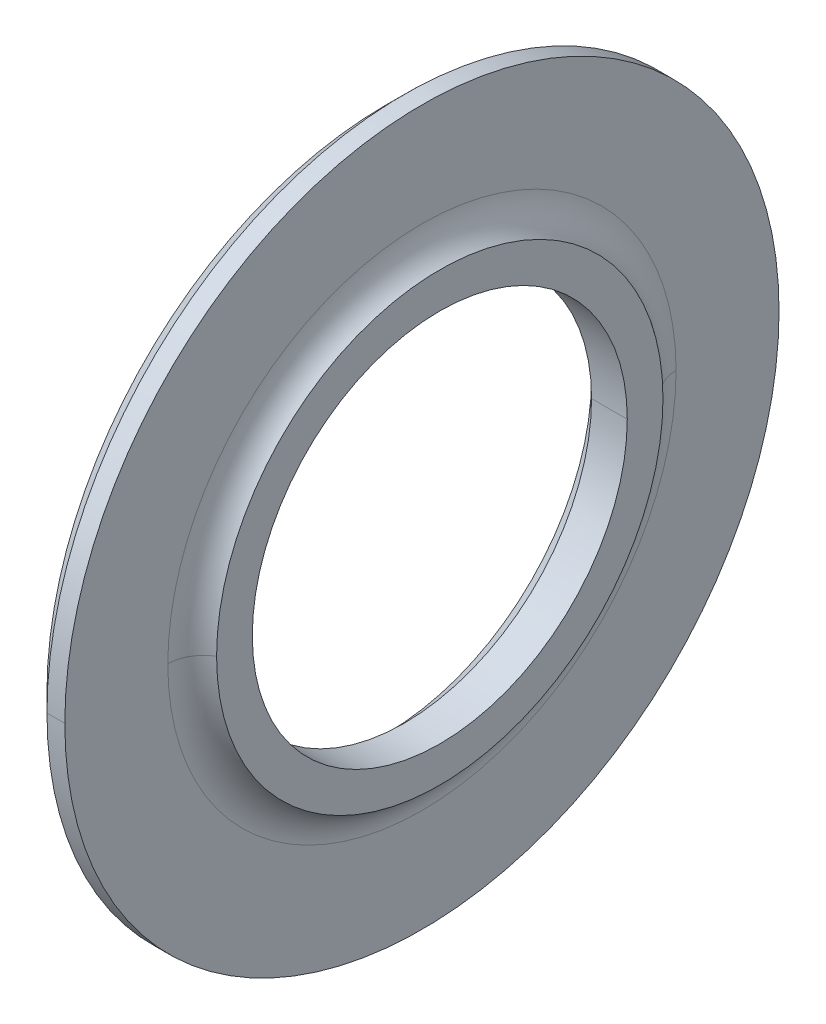
ISO-10303-21;
HEADER;
FILE_DESCRIPTION(('STEP AP214'),'2;1');
FILE_NAME('part.step','',(''),(''),'','','');
FILE_SCHEMA(('AUTOMOTIVE_DESIGN { 1 0 10303 214 1 1 1 1 }'));
ENDSEC;
DATA;
#1=APPLICATION_CONTEXT('core data for automotive mechanical design processes');
#2=APPLICATION_PROTOCOL_DEFINITION('international standard','automotive_design',2000,#1);
#3=PRODUCT_CONTEXT('',#1,'mechanical');
#4=PRODUCT('Part','Part','',(#3));
#5=PRODUCT_RELATED_PRODUCT_CATEGORY('part','',(#4));
#6=PRODUCT_DEFINITION_FORMATION('','',#4);
#7=PRODUCT_DEFINITION_CONTEXT('part definition',#1,'design');
#8=PRODUCT_DEFINITION('design','',#6,#7);
#9=PRODUCT_DEFINITION_SHAPE('','',#8);
#10=(LENGTH_UNIT() NAMED_UNIT(*) SI_UNIT(.MILLI.,.METRE.));
#11=(NAMED_UNIT(*) PLANE_ANGLE_UNIT() SI_UNIT($,.RADIAN.));
#12=(NAMED_UNIT(*) SI_UNIT($,.STERADIAN.) SOLID_ANGLE_UNIT());
#13=UNCERTAINTY_MEASURE_WITH_UNIT(LENGTH_MEASURE(1.E-05),#10,'distance_accuracy_value','');
#14=(GEOMETRIC_REPRESENTATION_CONTEXT(3) GLOBAL_UNCERTAINTY_ASSIGNED_CONTEXT((#13)) GLOBAL_UNIT_ASSIGNED_CONTEXT((#10,
#11,#12)) REPRESENTATION_CONTEXT('',''));
#15=CARTESIAN_POINT('',(0.,0.,0.));
#16=DIRECTION('',(0.,0.,1.));
#17=DIRECTION('',(1.,0.,0.));
#18=AXIS2_PLACEMENT_3D('',#15,#16,#17);
#19=CARTESIAN_POINT('',(2.,0.,0.));
#20=DIRECTION('',(-1.,0.,0.));
#21=DIRECTION('',(0.,0.,1.));
#22=AXIS2_PLACEMENT_3D('',#19,#20,#21);
#23=TOROIDAL_SURFACE('',#22,7.11602540378444,1.);
#24=CARTESIAN_POINT('',(1.,0.,0.));
#25=DIRECTION('',(-1.,0.,0.));
#26=DIRECTION('',(0.,0.,1.));
#27=AXIS2_PLACEMENT_3D('',#24,#25,#26);
#28=CIRCLE('',#27,7.11602540378444);
#29=CARTESIAN_POINT('',(1.,0.,-7.11602540378444));
#30=VERTEX_POINT('',#29);
#31=CARTESIAN_POINT('',(1.,0.,7.11602540378444));
#32=VERTEX_POINT('',#31);
#33=EDGE_CURVE('E39',#30,#32,#28,.T.);
#34=ORIENTED_EDGE('',*,*,#33,.F.);
#35=CARTESIAN_POINT('',(2.,0.,-7.11602540378444));
#36=DIRECTION('',(0.,1.,0.));
#37=DIRECTION('',(0.,0.,1.));
#38=AXIS2_PLACEMENT_3D('',#35,#36,#37);
#39=CIRCLE('',#38,1.);
#40=CARTESIAN_POINT('',(1.5,0.,-6.25));
#41=VERTEX_POINT('',#40);
#42=EDGE_CURVE('E11',#30,#41,#39,.T.);
#43=ORIENTED_EDGE('',*,*,#42,.T.);
#44=CARTESIAN_POINT('',(1.5,0.,0.));
#45=DIRECTION('',(-1.,0.,0.));
#46=DIRECTION('',(0.,0.,1.));
#47=AXIS2_PLACEMENT_3D('',#44,#45,#46);
#48=CIRCLE('',#47,6.25);
#49=CARTESIAN_POINT('',(1.5,0.,6.25));
#50=VERTEX_POINT('',#49);
#51=EDGE_CURVE('E26',#41,#50,#48,.T.);
#52=ORIENTED_EDGE('',*,*,#51,.T.);
#53=CARTESIAN_POINT('',(2.,0.,7.11602540378444));
#54=DIRECTION('',(0.,-1.,0.));
#55=DIRECTION('',(0.,0.,-1.));
#56=AXIS2_PLACEMENT_3D('',#53,#54,#55);
#57=CIRCLE('',#56,1.);
#58=EDGE_CURVE('E159',#32,#50,#57,.T.);
#59=ORIENTED_EDGE('',*,*,#58,.F.);
#60=EDGE_LOOP('',(#34,#43,#52,#59));
#61=FACE_BOUND('',#60,.T.);
#62=ADVANCED_FACE('F16',(#61),#23,.F.);
#63=CARTESIAN_POINT('',(0.,0.,0.));
#64=DIRECTION('',(1.,0.,0.));
#65=DIRECTION('',(0.,0.,-1.));
#66=AXIS2_PLACEMENT_3D('',#63,#64,#65);
#67=CONICAL_SURFACE('',#66,9.5,0.785398163397448);
#68=CARTESIAN_POINT('',(0.,0.,0.));
#69=DIRECTION('',(-1.,0.,0.));
#70=DIRECTION('',(0.,0.,-1.));
#71=AXIS2_PLACEMENT_3D('',#68,#69,#70);
#72=CIRCLE('',#71,9.5);
#73=CARTESIAN_POINT('',(0.,0.,9.5));
#74=VERTEX_POINT('',#73);
#75=CARTESIAN_POINT('',(0.,0.,-9.5));
#76=VERTEX_POINT('',#75);
#77=EDGE_CURVE('E142',#74,#76,#72,.T.);
#78=ORIENTED_EDGE('',*,*,#77,.F.);
#79=DIRECTION('',(0.707106781186548,0.,0.707106781186548));
#80=VECTOR('',#79,1.);
#81=CARTESIAN_POINT('',(0.,0.,9.5));
#82=LINE('',#81,#80);
#83=CARTESIAN_POINT('',(0.500000000000006,0.,10.));
#84=VERTEX_POINT('',#83);
#85=EDGE_CURVE('E184',#74,#84,#82,.T.);
#86=ORIENTED_EDGE('',*,*,#85,.T.);
#87=CARTESIAN_POINT('',(0.500000000000006,0.,0.));
#88=DIRECTION('',(1.,0.,0.));
#89=DIRECTION('',(0.,0.,-1.));
#90=AXIS2_PLACEMENT_3D('',#87,#88,#89);
#91=CIRCLE('',#90,10.);
#92=CARTESIAN_POINT('',(0.500000000000006,0.,-10.));
#93=VERTEX_POINT('',#92);
#94=EDGE_CURVE('E177',#93,#84,#91,.T.);
#95=ORIENTED_EDGE('',*,*,#94,.F.);
#96=DIRECTION('',(0.707106781186548,0.,-0.707106781186548));
#97=VECTOR('',#96,1.);
#98=CARTESIAN_POINT('',(0.,0.,-9.5));
#99=LINE('',#98,#97);
#100=EDGE_CURVE('E137',#76,#93,#99,.T.);
#101=ORIENTED_EDGE('',*,*,#100,.F.);
#102=EDGE_LOOP('',(#78,#86,#95,#101));
#103=FACE_BOUND('',#102,.T.);
#104=ADVANCED_FACE('F309',(#103),#67,.T.);
#105=CARTESIAN_POINT('',(0.499999999999993,0.,0.));
#106=DIRECTION('',(-1.,0.,0.));
#107=DIRECTION('',(0.,0.,1.));
#108=AXIS2_PLACEMENT_3D('',#105,#106,#107);
#109=CONICAL_SURFACE('',#108,5.25,0.78539816339745);
#110=CARTESIAN_POINT('',(0.499999999999993,0.,0.));
#111=DIRECTION('',(-1.,0.,0.));
#112=DIRECTION('',(0.,0.,-1.));
#113=AXIS2_PLACEMENT_3D('',#110,#111,#112);
#114=CIRCLE('',#113,5.25);
#115=CARTESIAN_POINT('',(0.499999999999993,0.,-5.25));
#116=VERTEX_POINT('',#115);
#117=CARTESIAN_POINT('',(0.499999999999993,0.,5.25));
#118=VERTEX_POINT('',#117);
#119=EDGE_CURVE('E167',#116,#118,#114,.T.);
#120=ORIENTED_EDGE('',*,*,#119,.F.);
#121=DIRECTION('',(-0.707106781186546,0.,-0.707106781186549));
#122=VECTOR('',#121,1.);
#123=CARTESIAN_POINT('',(0.499999999999993,0.,-5.25));
#124=LINE('',#123,#122);
#125=CARTESIAN_POINT('',(0.,0.,-5.75));
#126=VERTEX_POINT('',#125);
#127=EDGE_CURVE('E140',#116,#126,#124,.T.);
#128=ORIENTED_EDGE('',*,*,#127,.T.);
#129=CARTESIAN_POINT('',(0.,0.,0.));
#130=DIRECTION('',(1.,0.,0.));
#131=DIRECTION('',(0.,0.,-1.));
#132=AXIS2_PLACEMENT_3D('',#129,#130,#131);
#133=CIRCLE('',#132,5.75);
#134=CARTESIAN_POINT('',(0.,0.,5.75));
#135=VERTEX_POINT('',#134);
#136=EDGE_CURVE('E121',#135,#126,#133,.T.);
#137=ORIENTED_EDGE('',*,*,#136,.F.);
#138=DIRECTION('',(-0.707106781186546,0.,0.707106781186549));
#139=VECTOR('',#138,1.);
#140=CARTESIAN_POINT('',(0.499999999999993,0.,5.25));
#141=LINE('',#140,#139);
#142=EDGE_CURVE('E129',#118,#135,#141,.T.);
#143=ORIENTED_EDGE('',*,*,#142,.F.);
#144=EDGE_LOOP('',(#120,#128,#137,#143));
#145=FACE_BOUND('',#144,.T.);
#146=ADVANCED_FACE('F139',(#145),#109,.F.);
#147=CARTESIAN_POINT('',(0.,0.,0.));
#148=DIRECTION('',(-1.,0.,0.));
#149=DIRECTION('',(0.,0.,1.));
#150=AXIS2_PLACEMENT_3D('',#147,#148,#149);
#151=CYLINDRICAL_SURFACE('',#150,10.);
#152=CARTESIAN_POINT('',(1.,0.,0.));
#153=DIRECTION('',(-1.,0.,0.));
#154=DIRECTION('',(0.,0.,1.));
#155=AXIS2_PLACEMENT_3D('',#152,#153,#154);
#156=CIRCLE('',#155,10.);
#157=CARTESIAN_POINT('',(1.,0.,10.));
#158=VERTEX_POINT('',#157);
#159=CARTESIAN_POINT('',(1.,0.,-10.));
#160=VERTEX_POINT('',#159);
#161=EDGE_CURVE('E176',#158,#160,#156,.T.);
#162=ORIENTED_EDGE('',*,*,#161,.T.);
#163=DIRECTION('',(-1.,0.,0.));
#164=VECTOR('',#163,1.);
#165=CARTESIAN_POINT('',(0.,0.,-10.));
#166=LINE('',#165,#164);
#167=EDGE_CURVE('E99',#160,#93,#166,.T.);
#168=ORIENTED_EDGE('',*,*,#167,.T.);
#169=ORIENTED_EDGE('',*,*,#94,.T.);
#170=DIRECTION('',(-1.,0.,0.));
#171=VECTOR('',#170,1.);
#172=CARTESIAN_POINT('',(0.,0.,10.));
#173=LINE('',#172,#171);
#174=EDGE_CURVE('E110',#158,#84,#173,.T.);
#175=ORIENTED_EDGE('',*,*,#174,.F.);
#176=EDGE_LOOP('',(#162,#168,#169,#175));
#177=FACE_BOUND('',#176,.T.);
#178=ADVANCED_FACE('F308',(#177),#151,.T.);
#179=CARTESIAN_POINT('',(0.,0.,0.));
#180=DIRECTION('',(-1.,0.,0.));
#181=DIRECTION('',(0.,0.,1.));
#182=AXIS2_PLACEMENT_3D('',#179,#180,#181);
#183=CYLINDRICAL_SURFACE('',#182,5.25);
#184=CARTESIAN_POINT('',(1.5,0.,0.));
#185=DIRECTION('',(-1.,0.,0.));
#186=DIRECTION('',(0.,0.,1.));
#187=AXIS2_PLACEMENT_3D('',#184,#185,#186);
#188=CIRCLE('',#187,5.25);
#189=CARTESIAN_POINT('',(1.5,0.,-5.25));
#190=VERTEX_POINT('',#189);
#191=CARTESIAN_POINT('',(1.5,0.,5.25));
#192=VERTEX_POINT('',#191);
#193=EDGE_CURVE('E20',#190,#192,#188,.T.);
#194=ORIENTED_EDGE('',*,*,#193,.F.);
#195=DIRECTION('',(-1.,0.,0.));
#196=VECTOR('',#195,1.);
#197=CARTESIAN_POINT('',(0.,0.,-5.25));
#198=LINE('',#197,#196);
#199=EDGE_CURVE('E183',#190,#116,#198,.T.);
#200=ORIENTED_EDGE('',*,*,#199,.T.);
#201=ORIENTED_EDGE('',*,*,#119,.T.);
#202=DIRECTION('',(-1.,0.,0.));
#203=VECTOR('',#202,1.);
#204=CARTESIAN_POINT('',(0.,0.,5.25));
#205=LINE('',#204,#203);
#206=EDGE_CURVE('E164',#192,#118,#205,.T.);
#207=ORIENTED_EDGE('',*,*,#206,.F.);
#208=EDGE_LOOP('',(#194,#200,#201,#207));
#209=FACE_BOUND('',#208,.T.);
#210=ADVANCED_FACE('F355',(#209),#183,.F.);
#211=CARTESIAN_POINT('',(0.,0.,0.));
#212=DIRECTION('',(-1.,0.,0.));
#213=DIRECTION('',(0.,0.,1.));
#214=AXIS2_PLACEMENT_3D('',#211,#212,#213);
#215=CYLINDRICAL_SURFACE('',#214,5.25);
#216=ORIENTED_EDGE('',*,*,#199,.F.);
#217=CARTESIAN_POINT('',(1.5,0.,0.));
#218=DIRECTION('',(-1.,0.,0.));
#219=DIRECTION('',(0.,0.,1.));
#220=AXIS2_PLACEMENT_3D('',#217,#218,#219);
#221=CIRCLE('',#220,5.25);
#222=EDGE_CURVE('E153',#192,#190,#221,.T.);
#223=ORIENTED_EDGE('',*,*,#222,.F.);
#224=ORIENTED_EDGE('',*,*,#206,.T.);
#225=CARTESIAN_POINT('',(0.499999999999993,0.,0.));
#226=DIRECTION('',(-1.,0.,0.));
#227=DIRECTION('',(0.,0.,-1.));
#228=AXIS2_PLACEMENT_3D('',#225,#226,#227);
#229=CIRCLE('',#228,5.25);
#230=EDGE_CURVE('E133',#118,#116,#229,.T.);
#231=ORIENTED_EDGE('',*,*,#230,.T.);
#232=EDGE_LOOP('',(#216,#223,#224,#231));
#233=FACE_BOUND('',#232,.T.);
#234=ADVANCED_FACE('F359',(#233),#215,.F.);
#235=CARTESIAN_POINT('',(1.5,0.,-5.25));
#236=DIRECTION('',(-1.,0.,0.));
#237=DIRECTION('',(0.,0.,1.));
#238=AXIS2_PLACEMENT_3D('',#235,#236,#237);
#239=PLANE('',#238);
#240=CARTESIAN_POINT('',(1.5,0.,0.));
#241=DIRECTION('',(-1.,0.,0.));
#242=DIRECTION('',(0.,0.,1.));
#243=AXIS2_PLACEMENT_3D('',#240,#241,#242);
#244=CIRCLE('',#243,6.25);
#245=EDGE_CURVE('E190',#50,#41,#244,.T.);
#246=ORIENTED_EDGE('',*,*,#245,.F.);
#247=ORIENTED_EDGE('',*,*,#51,.F.);
#248=EDGE_LOOP('',(#246,#247));
#249=FACE_BOUND('',#248,.T.);
#250=ORIENTED_EDGE('',*,*,#222,.T.);
#251=ORIENTED_EDGE('',*,*,#193,.T.);
#252=EDGE_LOOP('',(#250,#251));
#253=FACE_BOUND('',#252,.T.);
#254=ADVANCED_FACE('F326',(#249,#253),#239,.F.);
#255=CARTESIAN_POINT('',(1.,0.,-10.));
#256=DIRECTION('',(-1.,0.,0.));
#257=DIRECTION('',(0.,0.,1.));
#258=AXIS2_PLACEMENT_3D('',#255,#256,#257);
#259=PLANE('',#258);
#260=ORIENTED_EDGE('',*,*,#161,.F.);
#261=CARTESIAN_POINT('',(1.,0.,0.));
#262=DIRECTION('',(-1.,0.,0.));
#263=DIRECTION('',(0.,0.,1.));
#264=AXIS2_PLACEMENT_3D('',#261,#262,#263);
#265=CIRCLE('',#264,10.);
#266=EDGE_CURVE('E151',#160,#158,#265,.T.);
#267=ORIENTED_EDGE('',*,*,#266,.F.);
#268=EDGE_LOOP('',(#260,#267));
#269=FACE_BOUND('',#268,.T.);
#270=CARTESIAN_POINT('',(1.,0.,0.));
#271=DIRECTION('',(-1.,0.,0.));
#272=DIRECTION('',(0.,0.,1.));
#273=AXIS2_PLACEMENT_3D('',#270,#271,#272);
#274=CIRCLE('',#273,7.11602540378444);
#275=EDGE_CURVE('E192',#32,#30,#274,.T.);
#276=ORIENTED_EDGE('',*,*,#275,.T.);
#277=ORIENTED_EDGE('',*,*,#33,.T.);
#278=EDGE_LOOP('',(#276,#277));
#279=FACE_BOUND('',#278,.T.);
#280=ADVANCED_FACE('F321',(#269,#279),#259,.F.);
#281=CARTESIAN_POINT('',(0.,0.,0.));
#282=DIRECTION('',(-1.,0.,0.));
#283=DIRECTION('',(0.,0.,1.));
#284=AXIS2_PLACEMENT_3D('',#281,#282,#283);
#285=CYLINDRICAL_SURFACE('',#284,10.);
#286=ORIENTED_EDGE('',*,*,#167,.F.);
#287=ORIENTED_EDGE('',*,*,#266,.T.);
#288=ORIENTED_EDGE('',*,*,#174,.T.);
#289=CARTESIAN_POINT('',(0.500000000000006,0.,0.));
#290=DIRECTION('',(1.,0.,0.));
#291=DIRECTION('',(0.,0.,-1.));
#292=AXIS2_PLACEMENT_3D('',#289,#290,#291);
#293=CIRCLE('',#292,10.);
#294=EDGE_CURVE('E170',#84,#93,#293,.T.);
#295=ORIENTED_EDGE('',*,*,#294,.T.);
#296=EDGE_LOOP('',(#286,#287,#288,#295));
#297=FACE_BOUND('',#296,.T.);
#298=ADVANCED_FACE('F325',(#297),#285,.T.);
#299=CARTESIAN_POINT('',(0.,0.,-5.25));
#300=DIRECTION('',(1.,0.,0.));
#301=DIRECTION('',(0.,1.,0.));
#302=AXIS2_PLACEMENT_3D('',#299,#300,#301);
#303=PLANE('',#302);
#304=CARTESIAN_POINT('',(0.,0.,0.));
#305=DIRECTION('',(-1.,0.,0.));
#306=DIRECTION('',(0.,0.,-1.));
#307=AXIS2_PLACEMENT_3D('',#304,#305,#306);
#308=CIRCLE('',#307,9.5);
#309=EDGE_CURVE('E163',#76,#74,#308,.T.);
#310=ORIENTED_EDGE('',*,*,#309,.T.);
#311=ORIENTED_EDGE('',*,*,#77,.T.);
#312=EDGE_LOOP('',(#310,#311));
#313=FACE_BOUND('',#312,.T.);
#314=ORIENTED_EDGE('',*,*,#136,.T.);
#315=CARTESIAN_POINT('',(0.,0.,0.));
#316=DIRECTION('',(1.,0.,0.));
#317=DIRECTION('',(0.,0.,-1.));
#318=AXIS2_PLACEMENT_3D('',#315,#316,#317);
#319=CIRCLE('',#318,5.75);
#320=EDGE_CURVE('E131',#126,#135,#319,.T.);
#321=ORIENTED_EDGE('',*,*,#320,.T.);
#322=EDGE_LOOP('',(#314,#321));
#323=FACE_BOUND('',#322,.T.);
#324=ADVANCED_FACE('F144',(#313,#323),#303,.F.);
#325=CARTESIAN_POINT('',(0.499999999999993,0.,0.));
#326=DIRECTION('',(-1.,0.,0.));
#327=DIRECTION('',(0.,0.,1.));
#328=AXIS2_PLACEMENT_3D('',#325,#326,#327);
#329=CONICAL_SURFACE('',#328,5.25,0.78539816339745);
#330=ORIENTED_EDGE('',*,*,#127,.F.);
#331=ORIENTED_EDGE('',*,*,#230,.F.);
#332=ORIENTED_EDGE('',*,*,#142,.T.);
#333=ORIENTED_EDGE('',*,*,#320,.F.);
#334=EDGE_LOOP('',(#330,#331,#332,#333));
#335=FACE_BOUND('',#334,.T.);
#336=ADVANCED_FACE('F18',(#335),#329,.F.);
#337=CARTESIAN_POINT('',(0.,0.,0.));
#338=DIRECTION('',(1.,0.,0.));
#339=DIRECTION('',(0.,0.,-1.));
#340=AXIS2_PLACEMENT_3D('',#337,#338,#339);
#341=CONICAL_SURFACE('',#340,9.5,0.785398163397448);
#342=ORIENTED_EDGE('',*,*,#85,.F.);
#343=ORIENTED_EDGE('',*,*,#309,.F.);
#344=ORIENTED_EDGE('',*,*,#100,.T.);
#345=ORIENTED_EDGE('',*,*,#294,.F.);
#346=EDGE_LOOP('',(#342,#343,#344,#345));
#347=FACE_BOUND('',#346,.T.);
#348=ADVANCED_FACE('F299',(#347),#341,.T.);
#349=CARTESIAN_POINT('',(2.,0.,0.));
#350=DIRECTION('',(-1.,0.,0.));
#351=DIRECTION('',(0.,0.,1.));
#352=AXIS2_PLACEMENT_3D('',#349,#350,#351);
#353=TOROIDAL_SURFACE('',#352,7.11602540378444,1.);
#354=ORIENTED_EDGE('',*,*,#42,.F.);
#355=ORIENTED_EDGE('',*,*,#275,.F.);
#356=ORIENTED_EDGE('',*,*,#58,.T.);
#357=ORIENTED_EDGE('',*,*,#245,.T.);
#358=EDGE_LOOP('',(#354,#355,#356,#357));
#359=FACE_BOUND('',#358,.T.);
#360=ADVANCED_FACE('F295',(#359),#353,.F.);
#361=CLOSED_SHELL('',(#62,#104,#146,#178,#210,#234,#254,#280,#298,#324,#336,#348,#360));
#362=MANIFOLD_SOLID_BREP('B1',#361);
#363=ADVANCED_BREP_SHAPE_REPRESENTATION('',(#18,#362),#14);
#364=SHAPE_DEFINITION_REPRESENTATION(#9,#363);
ENDSEC;
END-ISO-10303-21;
